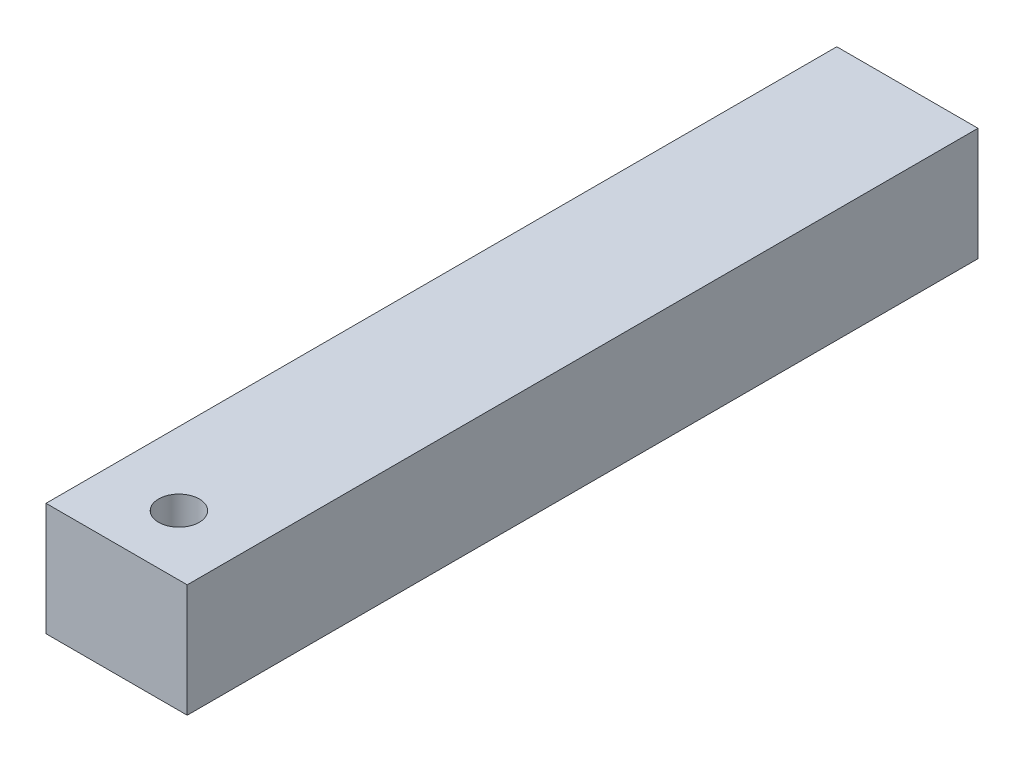
ISO-10303-21;
HEADER;
FILE_DESCRIPTION(('STEP AP214'),'2;1');
FILE_NAME('part.step','',(''),(''),'','','');
FILE_SCHEMA(('AUTOMOTIVE_DESIGN { 1 0 10303 214 1 1 1 1 }'));
ENDSEC;
DATA;
#1=APPLICATION_CONTEXT('core data for automotive mechanical design processes');
#2=APPLICATION_PROTOCOL_DEFINITION('international standard','automotive_design',2000,#1);
#3=PRODUCT_CONTEXT('',#1,'mechanical');
#4=PRODUCT('Part','Part','',(#3));
#5=PRODUCT_RELATED_PRODUCT_CATEGORY('part','',(#4));
#6=PRODUCT_DEFINITION_FORMATION('','',#4);
#7=PRODUCT_DEFINITION_CONTEXT('part definition',#1,'design');
#8=PRODUCT_DEFINITION('design','',#6,#7);
#9=PRODUCT_DEFINITION_SHAPE('','',#8);
#10=(LENGTH_UNIT() NAMED_UNIT(*) SI_UNIT(.MILLI.,.METRE.));
#11=(NAMED_UNIT(*) PLANE_ANGLE_UNIT() SI_UNIT($,.RADIAN.));
#12=(NAMED_UNIT(*) SI_UNIT($,.STERADIAN.) SOLID_ANGLE_UNIT());
#13=UNCERTAINTY_MEASURE_WITH_UNIT(LENGTH_MEASURE(1.E-05),#10,'distance_accuracy_value','');
#14=(GEOMETRIC_REPRESENTATION_CONTEXT(3) GLOBAL_UNCERTAINTY_ASSIGNED_CONTEXT((#13)) GLOBAL_UNIT_ASSIGNED_CONTEXT((#10,
#11,#12)) REPRESENTATION_CONTEXT('',''));
#15=CARTESIAN_POINT('',(0.,0.,0.));
#16=DIRECTION('',(0.,0.,1.));
#17=DIRECTION('',(1.,0.,0.));
#18=AXIS2_PLACEMENT_3D('',#15,#16,#17);
#19=CARTESIAN_POINT('',(0.,25.4,0.));
#20=DIRECTION('',(1.,0.,0.));
#21=DIRECTION('',(0.,0.,-1.));
#22=AXIS2_PLACEMENT_3D('',#19,#20,#21);
#23=PLANE('',#22);
#24=DIRECTION('',(0.,0.,1.));
#25=VECTOR('',#24,1.);
#26=CARTESIAN_POINT('',(0.,0.,0.));
#27=LINE('',#26,#25);
#28=CARTESIAN_POINT('',(0.,0.,0.));
#29=VERTEX_POINT('',#28);
#30=CARTESIAN_POINT('',(0.,0.,177.8));
#31=VERTEX_POINT('',#30);
#32=EDGE_CURVE('E97',#29,#31,#27,.T.);
#33=ORIENTED_EDGE('',*,*,#32,.T.);
#34=DIRECTION('',(0.,-1.,0.));
#35=VECTOR('',#34,1.);
#36=CARTESIAN_POINT('',(0.,25.4,177.8));
#37=LINE('',#36,#35);
#38=CARTESIAN_POINT('',(0.,25.4,177.8));
#39=VERTEX_POINT('',#38);
#40=EDGE_CURVE('E11',#39,#31,#37,.T.);
#41=ORIENTED_EDGE('',*,*,#40,.F.);
#42=DIRECTION('',(0.,0.,1.));
#43=VECTOR('',#42,1.);
#44=CARTESIAN_POINT('',(0.,25.4,0.));
#45=LINE('',#44,#43);
#46=CARTESIAN_POINT('',(0.,25.4,0.));
#47=VERTEX_POINT('',#46);
#48=EDGE_CURVE('E85',#47,#39,#45,.T.);
#49=ORIENTED_EDGE('',*,*,#48,.F.);
#50=DIRECTION('',(0.,-1.,0.));
#51=VECTOR('',#50,1.);
#52=CARTESIAN_POINT('',(0.,25.4,0.));
#53=LINE('',#52,#51);
#54=EDGE_CURVE('E93',#47,#29,#53,.T.);
#55=ORIENTED_EDGE('',*,*,#54,.T.);
#56=EDGE_LOOP('',(#33,#41,#49,#55));
#57=FACE_BOUND('',#56,.T.);
#58=ADVANCED_FACE('F34',(#57),#23,.F.);
#59=CARTESIAN_POINT('',(0.,25.4,177.8));
#60=DIRECTION('',(0.,0.,-1.));
#61=DIRECTION('',(-1.,0.,0.));
#62=AXIS2_PLACEMENT_3D('',#59,#60,#61);
#63=PLANE('',#62);
#64=DIRECTION('',(1.,0.,0.));
#65=VECTOR('',#64,1.);
#66=CARTESIAN_POINT('',(0.,0.,177.8));
#67=LINE('',#66,#65);
#68=CARTESIAN_POINT('',(31.75,0.,177.8));
#69=VERTEX_POINT('',#68);
#70=EDGE_CURVE('E89',#31,#69,#67,.T.);
#71=ORIENTED_EDGE('',*,*,#70,.T.);
#72=DIRECTION('',(0.,-1.,0.));
#73=VECTOR('',#72,1.);
#74=CARTESIAN_POINT('',(31.75,25.4,177.8));
#75=LINE('',#74,#73);
#76=CARTESIAN_POINT('',(31.75,25.4,177.8));
#77=VERTEX_POINT('',#76);
#78=EDGE_CURVE('E42',#77,#69,#75,.T.);
#79=ORIENTED_EDGE('',*,*,#78,.F.);
#80=DIRECTION('',(1.,0.,0.));
#81=VECTOR('',#80,1.);
#82=CARTESIAN_POINT('',(0.,25.4,177.8));
#83=LINE('',#82,#81);
#84=EDGE_CURVE('E80',#39,#77,#83,.T.);
#85=ORIENTED_EDGE('',*,*,#84,.F.);
#86=ORIENTED_EDGE('',*,*,#40,.T.);
#87=EDGE_LOOP('',(#71,#79,#85,#86));
#88=FACE_BOUND('',#87,.T.);
#89=ADVANCED_FACE('F88',(#88),#63,.F.);
#90=CARTESIAN_POINT('',(31.75,25.4,0.));
#91=DIRECTION('',(-1.,0.,0.));
#92=DIRECTION('',(0.,0.,1.));
#93=AXIS2_PLACEMENT_3D('',#90,#91,#92);
#94=PLANE('',#93);
#95=DIRECTION('',(0.,0.,-1.));
#96=VECTOR('',#95,1.);
#97=CARTESIAN_POINT('',(31.75,0.,0.));
#98=LINE('',#97,#96);
#99=CARTESIAN_POINT('',(31.75,0.,0.));
#100=VERTEX_POINT('',#99);
#101=EDGE_CURVE('E67',#69,#100,#98,.T.);
#102=ORIENTED_EDGE('',*,*,#101,.T.);
#103=DIRECTION('',(0.,-1.,0.));
#104=VECTOR('',#103,1.);
#105=CARTESIAN_POINT('',(31.75,25.4,0.));
#106=LINE('',#105,#104);
#107=CARTESIAN_POINT('',(31.75,25.4,0.));
#108=VERTEX_POINT('',#107);
#109=EDGE_CURVE('E90',#108,#100,#106,.T.);
#110=ORIENTED_EDGE('',*,*,#109,.F.);
#111=DIRECTION('',(0.,0.,-1.));
#112=VECTOR('',#111,1.);
#113=CARTESIAN_POINT('',(31.75,25.4,0.));
#114=LINE('',#113,#112);
#115=EDGE_CURVE('E83',#77,#108,#114,.T.);
#116=ORIENTED_EDGE('',*,*,#115,.F.);
#117=ORIENTED_EDGE('',*,*,#78,.T.);
#118=EDGE_LOOP('',(#102,#110,#116,#117));
#119=FACE_BOUND('',#118,.T.);
#120=ADVANCED_FACE('F91',(#119),#94,.F.);
#121=CARTESIAN_POINT('',(0.,25.4,0.));
#122=DIRECTION('',(0.,0.,1.));
#123=DIRECTION('',(1.,0.,0.));
#124=AXIS2_PLACEMENT_3D('',#121,#122,#123);
#125=PLANE('',#124);
#126=DIRECTION('',(-1.,0.,0.));
#127=VECTOR('',#126,1.);
#128=CARTESIAN_POINT('',(0.,0.,0.));
#129=LINE('',#128,#127);
#130=EDGE_CURVE('E73',#100,#29,#129,.T.);
#131=ORIENTED_EDGE('',*,*,#130,.T.);
#132=ORIENTED_EDGE('',*,*,#54,.F.);
#133=DIRECTION('',(-1.,0.,0.));
#134=VECTOR('',#133,1.);
#135=CARTESIAN_POINT('',(0.,25.4,0.));
#136=LINE('',#135,#134);
#137=EDGE_CURVE('E50',#108,#47,#136,.T.);
#138=ORIENTED_EDGE('',*,*,#137,.F.);
#139=ORIENTED_EDGE('',*,*,#109,.T.);
#140=EDGE_LOOP('',(#131,#132,#138,#139));
#141=FACE_BOUND('',#140,.T.);
#142=ADVANCED_FACE('F105',(#141),#125,.F.);
#143=CARTESIAN_POINT('',(0.,25.4,0.));
#144=DIRECTION('',(0.,1.,0.));
#145=DIRECTION('',(0.,0.,1.));
#146=AXIS2_PLACEMENT_3D('',#143,#144,#145);
#147=PLANE('',#146);
#148=CARTESIAN_POINT('',(16.3717900652465,25.4,164.287892401153));
#149=DIRECTION('',(0.,1.,0.));
#150=DIRECTION('',(0.,0.,1.));
#151=AXIS2_PLACEMENT_3D('',#148,#149,#150);
#152=CIRCLE('',#151,4.56862167202189);
#153=CARTESIAN_POINT('',(16.3717900652465,25.4,168.856514073175));
#154=VERTEX_POINT('',#153);
#155=EDGE_CURVE('E111',#154,#154,#152,.T.);
#156=ORIENTED_EDGE('',*,*,#155,.F.);
#157=EDGE_LOOP('',(#156));
#158=FACE_BOUND('',#157,.T.);
#159=ORIENTED_EDGE('',*,*,#48,.T.);
#160=ORIENTED_EDGE('',*,*,#84,.T.);
#161=ORIENTED_EDGE('',*,*,#115,.T.);
#162=ORIENTED_EDGE('',*,*,#137,.T.);
#163=EDGE_LOOP('',(#159,#160,#161,#162));
#164=FACE_BOUND('',#163,.T.);
#165=ADVANCED_FACE('F81',(#158,#164),#147,.T.);
#166=CARTESIAN_POINT('',(0.,0.,0.));
#167=DIRECTION('',(0.,1.,0.));
#168=DIRECTION('',(0.,0.,1.));
#169=AXIS2_PLACEMENT_3D('',#166,#167,#168);
#170=PLANE('',#169);
#171=CARTESIAN_POINT('',(16.3717900652465,0.,164.287892401153));
#172=DIRECTION('',(0.,1.,0.));
#173=DIRECTION('',(0.,0.,1.));
#174=AXIS2_PLACEMENT_3D('',#171,#172,#173);
#175=CIRCLE('',#174,4.56862167202189);
#176=CARTESIAN_POINT('',(16.3717900652465,0.,168.856514073175));
#177=VERTEX_POINT('',#176);
#178=EDGE_CURVE('E100',#177,#177,#175,.T.);
#179=ORIENTED_EDGE('',*,*,#178,.T.);
#180=EDGE_LOOP('',(#179));
#181=FACE_BOUND('',#180,.T.);
#182=ORIENTED_EDGE('',*,*,#32,.F.);
#183=ORIENTED_EDGE('',*,*,#130,.F.);
#184=ORIENTED_EDGE('',*,*,#101,.F.);
#185=ORIENTED_EDGE('',*,*,#70,.F.);
#186=EDGE_LOOP('',(#182,#183,#184,#185));
#187=FACE_BOUND('',#186,.T.);
#188=ADVANCED_FACE('F108',(#181,#187),#170,.F.);
#189=CARTESIAN_POINT('',(16.3717900652465,0.,164.287892401153));
#190=DIRECTION('',(0.,1.,0.));
#191=DIRECTION('',(0.,0.,1.));
#192=AXIS2_PLACEMENT_3D('',#189,#190,#191);
#193=CYLINDRICAL_SURFACE('',#192,4.56862167202189);
#194=ORIENTED_EDGE('',*,*,#178,.F.);
#195=EDGE_LOOP('',(#194));
#196=FACE_BOUND('',#195,.T.);
#197=ORIENTED_EDGE('',*,*,#155,.T.);
#198=EDGE_LOOP('',(#197));
#199=FACE_BOUND('',#198,.T.);
#200=ADVANCED_FACE('F118',(#196,#199),#193,.F.);
#201=CLOSED_SHELL('',(#58,#89,#120,#142,#165,#188,#200));
#202=MANIFOLD_SOLID_BREP('B2',#201);
#203=ADVANCED_BREP_SHAPE_REPRESENTATION('',(#18,#202),#14);
#204=SHAPE_DEFINITION_REPRESENTATION(#9,#203);
ENDSEC;
END-ISO-10303-21;
